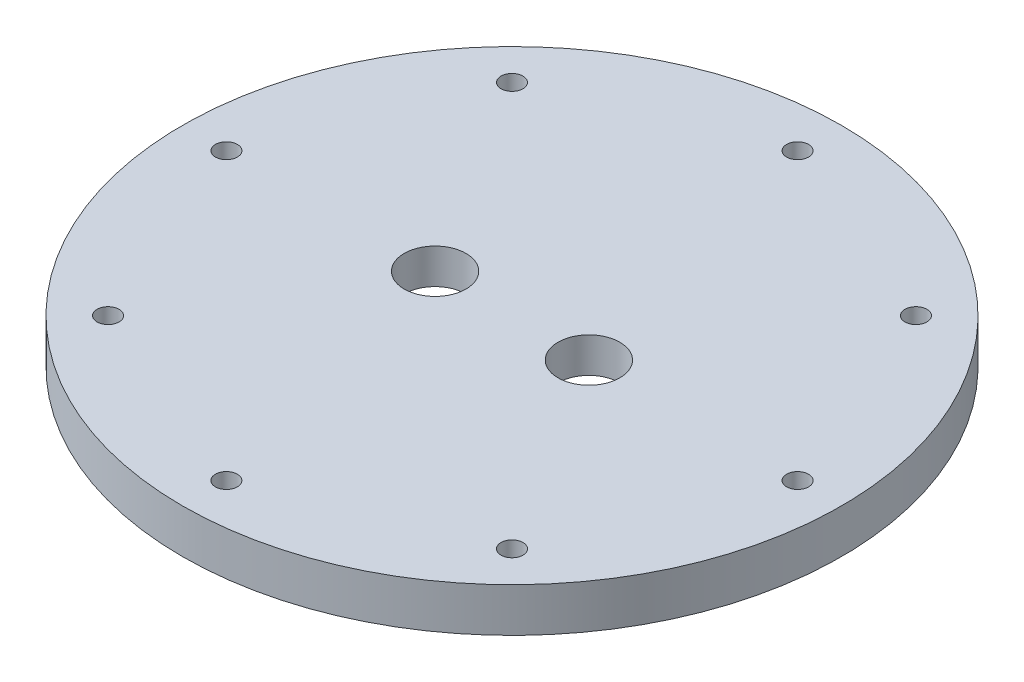
ISO-10303-21;
HEADER;
FILE_DESCRIPTION(('STEP AP214'),'2;1');
FILE_NAME('part.step','',(''),(''),'','','');
FILE_SCHEMA(('AUTOMOTIVE_DESIGN { 1 0 10303 214 1 1 1 1 }'));
ENDSEC;
DATA;
#1=APPLICATION_CONTEXT('core data for automotive mechanical design processes');
#2=APPLICATION_PROTOCOL_DEFINITION('international standard','automotive_design',2000,#1);
#3=PRODUCT_CONTEXT('',#1,'mechanical');
#4=PRODUCT('Part','Part','',(#3));
#5=PRODUCT_RELATED_PRODUCT_CATEGORY('part','',(#4));
#6=PRODUCT_DEFINITION_FORMATION('','',#4);
#7=PRODUCT_DEFINITION_CONTEXT('part definition',#1,'design');
#8=PRODUCT_DEFINITION('design','',#6,#7);
#9=PRODUCT_DEFINITION_SHAPE('','',#8);
#10=(LENGTH_UNIT() NAMED_UNIT(*) SI_UNIT(.MILLI.,.METRE.));
#11=(NAMED_UNIT(*) PLANE_ANGLE_UNIT() SI_UNIT($,.RADIAN.));
#12=(NAMED_UNIT(*) SI_UNIT($,.STERADIAN.) SOLID_ANGLE_UNIT());
#13=UNCERTAINTY_MEASURE_WITH_UNIT(LENGTH_MEASURE(1.E-05),#10,'distance_accuracy_value','');
#14=(GEOMETRIC_REPRESENTATION_CONTEXT(3) GLOBAL_UNCERTAINTY_ASSIGNED_CONTEXT((#13)) GLOBAL_UNIT_ASSIGNED_CONTEXT((#10,
#11,#12)) REPRESENTATION_CONTEXT('',''));
#15=CARTESIAN_POINT('',(0.,0.,0.));
#16=DIRECTION('',(0.,0.,1.));
#17=DIRECTION('',(1.,0.,0.));
#18=AXIS2_PLACEMENT_3D('',#15,#16,#17);
#19=CARTESIAN_POINT('',(0.,12.7,0.));
#20=DIRECTION('',(0.,-1.,0.));
#21=DIRECTION('',(0.,0.,-1.));
#22=AXIS2_PLACEMENT_3D('',#19,#20,#21);
#23=CYLINDRICAL_SURFACE('',#22,95.25);
#24=CARTESIAN_POINT('',(0.,12.7,0.));
#25=DIRECTION('',(0.,1.,0.));
#26=DIRECTION('',(0.,0.,1.));
#27=AXIS2_PLACEMENT_3D('',#24,#25,#26);
#28=CIRCLE('',#27,95.25);
#29=CARTESIAN_POINT('',(0.,12.7,95.25));
#30=VERTEX_POINT('',#29);
#31=EDGE_CURVE('E10',#30,#30,#28,.T.);
#32=ORIENTED_EDGE('',*,*,#31,.F.);
#33=EDGE_LOOP('',(#32));
#34=FACE_BOUND('',#33,.T.);
#35=CARTESIAN_POINT('',(0.,0.,0.));
#36=DIRECTION('',(0.,1.,0.));
#37=DIRECTION('',(0.,0.,1.));
#38=AXIS2_PLACEMENT_3D('',#35,#36,#37);
#39=CIRCLE('',#38,95.25);
#40=CARTESIAN_POINT('',(0.,0.,95.25));
#41=VERTEX_POINT('',#40);
#42=EDGE_CURVE('E40',#41,#41,#39,.T.);
#43=ORIENTED_EDGE('',*,*,#42,.T.);
#44=EDGE_LOOP('',(#43));
#45=FACE_BOUND('',#44,.T.);
#46=ADVANCED_FACE('F37',(#34,#45),#23,.T.);
#47=CARTESIAN_POINT('',(0.,12.7,0.));
#48=DIRECTION('',(0.,1.,0.));
#49=DIRECTION('',(0.,0.,1.));
#50=AXIS2_PLACEMENT_3D('',#47,#48,#49);
#51=PLANE('',#50);
#52=CARTESIAN_POINT('',(22.225,12.7,0.));
#53=DIRECTION('',(0.,1.,0.));
#54=DIRECTION('',(0.,0.,1.));
#55=AXIS2_PLACEMENT_3D('',#52,#53,#54);
#56=CIRCLE('',#55,8.929751);
#57=CARTESIAN_POINT('',(22.225,12.7,8.929751));
#58=VERTEX_POINT('',#57);
#59=EDGE_CURVE('E146',#58,#58,#56,.T.);
#60=ORIENTED_EDGE('',*,*,#59,.F.);
#61=EDGE_LOOP('',(#60));
#62=FACE_BOUND('',#61,.T.);
#63=CARTESIAN_POINT('',(-22.225,12.7,0.));
#64=DIRECTION('',(0.,1.,0.));
#65=DIRECTION('',(0.,0.,1.));
#66=AXIS2_PLACEMENT_3D('',#63,#64,#65);
#67=CIRCLE('',#66,8.929751);
#68=CARTESIAN_POINT('',(-22.225,12.7,8.92975099999999));
#69=VERTEX_POINT('',#68);
#70=EDGE_CURVE('E135',#69,#69,#67,.T.);
#71=ORIENTED_EDGE('',*,*,#70,.F.);
#72=EDGE_LOOP('',(#71));
#73=FACE_BOUND('',#72,.T.);
#74=CARTESIAN_POINT('',(58.3716647869488,12.7,58.3716647869502));
#75=DIRECTION('',(0.,-1.,0.));
#76=DIRECTION('',(0.,0.,-1.));
#77=AXIS2_PLACEMENT_3D('',#74,#75,#76);
#78=CIRCLE('',#77,3.175);
#79=CARTESIAN_POINT('',(58.3716647869488,12.7,55.1966647869502));
#80=VERTEX_POINT('',#79);
#81=EDGE_CURVE('E106',#80,#80,#78,.T.);
#82=ORIENTED_EDGE('',*,*,#81,.T.);
#83=EDGE_LOOP('',(#82));
#84=FACE_BOUND('',#83,.T.);
#85=CARTESIAN_POINT('',(82.55,12.7,8.64665353564502E-13));
#86=DIRECTION('',(0.,-1.,0.));
#87=DIRECTION('',(0.,0.,-1.));
#88=AXIS2_PLACEMENT_3D('',#85,#86,#87);
#89=CIRCLE('',#88,3.175);
#90=CARTESIAN_POINT('',(82.55,12.7,-3.17499999999913));
#91=VERTEX_POINT('',#90);
#92=EDGE_CURVE('E98',#91,#91,#89,.T.);
#93=ORIENTED_EDGE('',*,*,#92,.T.);
#94=EDGE_LOOP('',(#93));
#95=FACE_BOUND('',#94,.T.);
#96=CARTESIAN_POINT('',(58.37166478695,12.7,-58.371664786949));
#97=DIRECTION('',(0.,-1.,0.));
#98=DIRECTION('',(0.,0.,-1.));
#99=AXIS2_PLACEMENT_3D('',#96,#97,#98);
#100=CIRCLE('',#99,3.175);
#101=CARTESIAN_POINT('',(58.37166478695,12.7,-61.546664786949));
#102=VERTEX_POINT('',#101);
#103=EDGE_CURVE('E90',#102,#102,#100,.T.);
#104=ORIENTED_EDGE('',*,*,#103,.T.);
#105=EDGE_LOOP('',(#104));
#106=FACE_BOUND('',#105,.T.);
#107=CARTESIAN_POINT('',(0.,12.7,-82.55));
#108=DIRECTION('',(0.,-1.,0.));
#109=DIRECTION('',(0.,0.,-1.));
#110=AXIS2_PLACEMENT_3D('',#107,#108,#109);
#111=CIRCLE('',#110,3.175);
#112=CARTESIAN_POINT('',(0.,12.7,-85.725));
#113=VERTEX_POINT('',#112);
#114=EDGE_CURVE('E82',#113,#113,#111,.T.);
#115=ORIENTED_EDGE('',*,*,#114,.T.);
#116=EDGE_LOOP('',(#115));
#117=FACE_BOUND('',#116,.T.);
#118=CARTESIAN_POINT('',(-58.3716647869492,12.7,-58.3716647869498));
#119=DIRECTION('',(0.,-1.,0.));
#120=DIRECTION('',(0.,0.,-1.));
#121=AXIS2_PLACEMENT_3D('',#118,#119,#120);
#122=CIRCLE('',#121,3.175);
#123=CARTESIAN_POINT('',(-58.3716647869492,12.7,-61.5466647869498));
#124=VERTEX_POINT('',#123);
#125=EDGE_CURVE('E74',#124,#124,#122,.T.);
#126=ORIENTED_EDGE('',*,*,#125,.T.);
#127=EDGE_LOOP('',(#126));
#128=FACE_BOUND('',#127,.T.);
#129=CARTESIAN_POINT('',(-82.55,12.7,-2.88221784521501E-13));
#130=DIRECTION('',(0.,-1.,0.));
#131=DIRECTION('',(0.,0.,-1.));
#132=AXIS2_PLACEMENT_3D('',#129,#130,#131);
#133=CIRCLE('',#132,3.175);
#134=CARTESIAN_POINT('',(-82.55,12.7,-3.17500000000029));
#135=VERTEX_POINT('',#134);
#136=EDGE_CURVE('E66',#135,#135,#133,.T.);
#137=ORIENTED_EDGE('',*,*,#136,.T.);
#138=EDGE_LOOP('',(#137));
#139=FACE_BOUND('',#138,.T.);
#140=CARTESIAN_POINT('',(-58.3716647869496,12.7,58.3716647869494));
#141=DIRECTION('',(0.,-1.,0.));
#142=DIRECTION('',(0.,0.,-1.));
#143=AXIS2_PLACEMENT_3D('',#140,#141,#142);
#144=CIRCLE('',#143,3.175);
#145=CARTESIAN_POINT('',(-58.3716647869496,12.7,55.1966647869494));
#146=VERTEX_POINT('',#145);
#147=EDGE_CURVE('E58',#146,#146,#144,.T.);
#148=ORIENTED_EDGE('',*,*,#147,.T.);
#149=EDGE_LOOP('',(#148));
#150=FACE_BOUND('',#149,.T.);
#151=CARTESIAN_POINT('',(0.,12.7,82.55));
#152=DIRECTION('',(0.,-1.,0.));
#153=DIRECTION('',(0.,0.,-1.));
#154=AXIS2_PLACEMENT_3D('',#151,#152,#153);
#155=CIRCLE('',#154,3.175);
#156=CARTESIAN_POINT('',(0.,12.7,79.375));
#157=VERTEX_POINT('',#156);
#158=EDGE_CURVE('E49',#157,#157,#155,.T.);
#159=ORIENTED_EDGE('',*,*,#158,.T.);
#160=EDGE_LOOP('',(#159));
#161=FACE_BOUND('',#160,.T.);
#162=ORIENTED_EDGE('',*,*,#31,.T.);
#163=EDGE_LOOP('',(#162));
#164=FACE_BOUND('',#163,.T.);
#165=ADVANCED_FACE('F180',(#62,#73,#84,#95,#106,#117,#128,#139,#150,#161,#164),#51,.T.);
#166=CARTESIAN_POINT('',(0.,0.,0.));
#167=DIRECTION('',(0.,1.,0.));
#168=DIRECTION('',(0.,0.,1.));
#169=AXIS2_PLACEMENT_3D('',#166,#167,#168);
#170=PLANE('',#169);
#171=CARTESIAN_POINT('',(0.,0.,0.));
#172=DIRECTION('',(0.,-1.,0.));
#173=DIRECTION('',(0.,0.,-1.));
#174=AXIS2_PLACEMENT_3D('',#171,#172,#173);
#175=CIRCLE('',#174,69.9135);
#176=CARTESIAN_POINT('',(0.,0.,-69.9135));
#177=VERTEX_POINT('',#176);
#178=EDGE_CURVE('E115',#177,#177,#175,.T.);
#179=ORIENTED_EDGE('',*,*,#178,.F.);
#180=EDGE_LOOP('',(#179));
#181=FACE_BOUND('',#180,.T.);
#182=CARTESIAN_POINT('',(58.3716647869488,0.,58.3716647869502));
#183=DIRECTION('',(0.,-1.,0.));
#184=DIRECTION('',(0.,0.,-1.));
#185=AXIS2_PLACEMENT_3D('',#182,#183,#184);
#186=CIRCLE('',#185,3.17499999999998);
#187=CARTESIAN_POINT('',(58.3716647869488,0.,55.1966647869502));
#188=VERTEX_POINT('',#187);
#189=EDGE_CURVE('E110',#188,#188,#186,.T.);
#190=ORIENTED_EDGE('',*,*,#189,.F.);
#191=EDGE_LOOP('',(#190));
#192=FACE_BOUND('',#191,.T.);
#193=CARTESIAN_POINT('',(82.55,0.,8.64665353564502E-13));
#194=DIRECTION('',(0.,-1.,0.));
#195=DIRECTION('',(0.,0.,-1.));
#196=AXIS2_PLACEMENT_3D('',#193,#194,#195);
#197=CIRCLE('',#196,3.17499999999998);
#198=CARTESIAN_POINT('',(82.55,0.,-3.17499999999912));
#199=VERTEX_POINT('',#198);
#200=EDGE_CURVE('E102',#199,#199,#197,.T.);
#201=ORIENTED_EDGE('',*,*,#200,.F.);
#202=EDGE_LOOP('',(#201));
#203=FACE_BOUND('',#202,.T.);
#204=CARTESIAN_POINT('',(58.37166478695,0.,-58.371664786949));
#205=DIRECTION('',(0.,-1.,0.));
#206=DIRECTION('',(0.,0.,-1.));
#207=AXIS2_PLACEMENT_3D('',#204,#205,#206);
#208=CIRCLE('',#207,3.17499999999999);
#209=CARTESIAN_POINT('',(58.37166478695,0.,-61.546664786949));
#210=VERTEX_POINT('',#209);
#211=EDGE_CURVE('E94',#210,#210,#208,.T.);
#212=ORIENTED_EDGE('',*,*,#211,.F.);
#213=EDGE_LOOP('',(#212));
#214=FACE_BOUND('',#213,.T.);
#215=CARTESIAN_POINT('',(0.,0.,-82.55));
#216=DIRECTION('',(0.,-1.,0.));
#217=DIRECTION('',(0.,0.,-1.));
#218=AXIS2_PLACEMENT_3D('',#215,#216,#217);
#219=CIRCLE('',#218,3.17499999999999);
#220=CARTESIAN_POINT('',(0.,0.,-85.725));
#221=VERTEX_POINT('',#220);
#222=EDGE_CURVE('E86',#221,#221,#219,.T.);
#223=ORIENTED_EDGE('',*,*,#222,.F.);
#224=EDGE_LOOP('',(#223));
#225=FACE_BOUND('',#224,.T.);
#226=CARTESIAN_POINT('',(-58.3716647869492,0.,-58.3716647869498));
#227=DIRECTION('',(0.,-1.,0.));
#228=DIRECTION('',(0.,0.,-1.));
#229=AXIS2_PLACEMENT_3D('',#226,#227,#228);
#230=CIRCLE('',#229,3.17499999999998);
#231=CARTESIAN_POINT('',(-58.3716647869492,0.,-61.5466647869498));
#232=VERTEX_POINT('',#231);
#233=EDGE_CURVE('E78',#232,#232,#230,.T.);
#234=ORIENTED_EDGE('',*,*,#233,.F.);
#235=EDGE_LOOP('',(#234));
#236=FACE_BOUND('',#235,.T.);
#237=CARTESIAN_POINT('',(-82.55,0.,-2.88221784521501E-13));
#238=DIRECTION('',(0.,-1.,0.));
#239=DIRECTION('',(0.,0.,-1.));
#240=AXIS2_PLACEMENT_3D('',#237,#238,#239);
#241=CIRCLE('',#240,3.17499999999998);
#242=CARTESIAN_POINT('',(-82.55,0.,-3.17500000000027));
#243=VERTEX_POINT('',#242);
#244=EDGE_CURVE('E70',#243,#243,#241,.T.);
#245=ORIENTED_EDGE('',*,*,#244,.F.);
#246=EDGE_LOOP('',(#245));
#247=FACE_BOUND('',#246,.T.);
#248=CARTESIAN_POINT('',(-58.3716647869496,0.,58.3716647869494));
#249=DIRECTION('',(0.,-1.,0.));
#250=DIRECTION('',(0.,0.,-1.));
#251=AXIS2_PLACEMENT_3D('',#248,#249,#250);
#252=CIRCLE('',#251,3.17499999999999);
#253=CARTESIAN_POINT('',(-58.3716647869496,0.,55.1966647869494));
#254=VERTEX_POINT('',#253);
#255=EDGE_CURVE('E62',#254,#254,#252,.T.);
#256=ORIENTED_EDGE('',*,*,#255,.F.);
#257=EDGE_LOOP('',(#256));
#258=FACE_BOUND('',#257,.T.);
#259=CARTESIAN_POINT('',(0.,0.,82.55));
#260=DIRECTION('',(0.,-1.,0.));
#261=DIRECTION('',(0.,0.,-1.));
#262=AXIS2_PLACEMENT_3D('',#259,#260,#261);
#263=CIRCLE('',#262,3.17499999999999);
#264=CARTESIAN_POINT('',(0.,0.,79.375));
#265=VERTEX_POINT('',#264);
#266=EDGE_CURVE('E54',#265,#265,#263,.T.);
#267=ORIENTED_EDGE('',*,*,#266,.F.);
#268=EDGE_LOOP('',(#267));
#269=FACE_BOUND('',#268,.T.);
#270=ORIENTED_EDGE('',*,*,#42,.F.);
#271=EDGE_LOOP('',(#270));
#272=FACE_BOUND('',#271,.T.);
#273=ADVANCED_FACE('F185',(#181,#192,#203,#214,#225,#236,#247,#258,#269,#272),#170,.F.);
#274=CARTESIAN_POINT('',(0.,0.,82.55));
#275=DIRECTION('',(0.,-1.,0.));
#276=DIRECTION('',(0.,0.,-1.));
#277=AXIS2_PLACEMENT_3D('',#274,#275,#276);
#278=CYLINDRICAL_SURFACE('',#277,3.17499999999999);
#279=ORIENTED_EDGE('',*,*,#158,.F.);
#280=EDGE_LOOP('',(#279));
#281=FACE_BOUND('',#280,.T.);
#282=ORIENTED_EDGE('',*,*,#266,.T.);
#283=EDGE_LOOP('',(#282));
#284=FACE_BOUND('',#283,.T.);
#285=ADVANCED_FACE('F192',(#281,#284),#278,.F.);
#286=CARTESIAN_POINT('',(-58.3716647869496,0.,58.3716647869494));
#287=DIRECTION('',(0.,-1.,0.));
#288=DIRECTION('',(0.,0.,-1.));
#289=AXIS2_PLACEMENT_3D('',#286,#287,#288);
#290=CYLINDRICAL_SURFACE('',#289,3.17499999999999);
#291=ORIENTED_EDGE('',*,*,#147,.F.);
#292=EDGE_LOOP('',(#291));
#293=FACE_BOUND('',#292,.T.);
#294=ORIENTED_EDGE('',*,*,#255,.T.);
#295=EDGE_LOOP('',(#294));
#296=FACE_BOUND('',#295,.T.);
#297=ADVANCED_FACE('F197',(#293,#296),#290,.F.);
#298=CARTESIAN_POINT('',(-82.55,0.,-2.88221784521501E-13));
#299=DIRECTION('',(0.,-1.,0.));
#300=DIRECTION('',(0.,0.,-1.));
#301=AXIS2_PLACEMENT_3D('',#298,#299,#300);
#302=CYLINDRICAL_SURFACE('',#301,3.17499999999999);
#303=ORIENTED_EDGE('',*,*,#136,.F.);
#304=EDGE_LOOP('',(#303));
#305=FACE_BOUND('',#304,.T.);
#306=ORIENTED_EDGE('',*,*,#244,.T.);
#307=EDGE_LOOP('',(#306));
#308=FACE_BOUND('',#307,.T.);
#309=ADVANCED_FACE('F205',(#305,#308),#302,.F.);
#310=CARTESIAN_POINT('',(-58.3716647869492,0.,-58.3716647869498));
#311=DIRECTION('',(0.,-1.,0.));
#312=DIRECTION('',(0.,0.,-1.));
#313=AXIS2_PLACEMENT_3D('',#310,#311,#312);
#314=CYLINDRICAL_SURFACE('',#313,3.17499999999999);
#315=ORIENTED_EDGE('',*,*,#125,.F.);
#316=EDGE_LOOP('',(#315));
#317=FACE_BOUND('',#316,.T.);
#318=ORIENTED_EDGE('',*,*,#233,.T.);
#319=EDGE_LOOP('',(#318));
#320=FACE_BOUND('',#319,.T.);
#321=ADVANCED_FACE('F209',(#317,#320),#314,.F.);
#322=CARTESIAN_POINT('',(0.,0.,-82.55));
#323=DIRECTION('',(0.,-1.,0.));
#324=DIRECTION('',(0.,0.,-1.));
#325=AXIS2_PLACEMENT_3D('',#322,#323,#324);
#326=CYLINDRICAL_SURFACE('',#325,3.17499999999999);
#327=ORIENTED_EDGE('',*,*,#114,.F.);
#328=EDGE_LOOP('',(#327));
#329=FACE_BOUND('',#328,.T.);
#330=ORIENTED_EDGE('',*,*,#222,.T.);
#331=EDGE_LOOP('',(#330));
#332=FACE_BOUND('',#331,.T.);
#333=ADVANCED_FACE('F213',(#329,#332),#326,.F.);
#334=CARTESIAN_POINT('',(58.37166478695,0.,-58.371664786949));
#335=DIRECTION('',(0.,-1.,0.));
#336=DIRECTION('',(0.,0.,-1.));
#337=AXIS2_PLACEMENT_3D('',#334,#335,#336);
#338=CYLINDRICAL_SURFACE('',#337,3.17499999999999);
#339=ORIENTED_EDGE('',*,*,#103,.F.);
#340=EDGE_LOOP('',(#339));
#341=FACE_BOUND('',#340,.T.);
#342=ORIENTED_EDGE('',*,*,#211,.T.);
#343=EDGE_LOOP('',(#342));
#344=FACE_BOUND('',#343,.T.);
#345=ADVANCED_FACE('F217',(#341,#344),#338,.F.);
#346=CARTESIAN_POINT('',(82.55,0.,8.64665353564502E-13));
#347=DIRECTION('',(0.,-1.,0.));
#348=DIRECTION('',(0.,0.,-1.));
#349=AXIS2_PLACEMENT_3D('',#346,#347,#348);
#350=CYLINDRICAL_SURFACE('',#349,3.17499999999999);
#351=ORIENTED_EDGE('',*,*,#92,.F.);
#352=EDGE_LOOP('',(#351));
#353=FACE_BOUND('',#352,.T.);
#354=ORIENTED_EDGE('',*,*,#200,.T.);
#355=EDGE_LOOP('',(#354));
#356=FACE_BOUND('',#355,.T.);
#357=ADVANCED_FACE('F221',(#353,#356),#350,.F.);
#358=CARTESIAN_POINT('',(58.3716647869488,0.,58.3716647869502));
#359=DIRECTION('',(0.,-1.,0.));
#360=DIRECTION('',(0.,0.,-1.));
#361=AXIS2_PLACEMENT_3D('',#358,#359,#360);
#362=CYLINDRICAL_SURFACE('',#361,3.17499999999999);
#363=ORIENTED_EDGE('',*,*,#81,.F.);
#364=EDGE_LOOP('',(#363));
#365=FACE_BOUND('',#364,.T.);
#366=ORIENTED_EDGE('',*,*,#189,.T.);
#367=EDGE_LOOP('',(#366));
#368=FACE_BOUND('',#367,.T.);
#369=ADVANCED_FACE('F225',(#365,#368),#362,.F.);
#370=CARTESIAN_POINT('',(0.,2.54,0.));
#371=DIRECTION('',(0.,-1.,0.));
#372=DIRECTION('',(0.,0.,-1.));
#373=AXIS2_PLACEMENT_3D('',#370,#371,#372);
#374=CYLINDRICAL_SURFACE('',#373,69.9135);
#375=CARTESIAN_POINT('',(0.,2.54,0.));
#376=DIRECTION('',(0.,-1.,0.));
#377=DIRECTION('',(0.,0.,-1.));
#378=AXIS2_PLACEMENT_3D('',#375,#376,#377);
#379=CIRCLE('',#378,69.9135);
#380=CARTESIAN_POINT('',(0.,2.54,-69.9135));
#381=VERTEX_POINT('',#380);
#382=EDGE_CURVE('E114',#381,#381,#379,.T.);
#383=ORIENTED_EDGE('',*,*,#382,.F.);
#384=EDGE_LOOP('',(#383));
#385=FACE_BOUND('',#384,.T.);
#386=ORIENTED_EDGE('',*,*,#178,.T.);
#387=EDGE_LOOP('',(#386));
#388=FACE_BOUND('',#387,.T.);
#389=ADVANCED_FACE('F229',(#385,#388),#374,.F.);
#390=CARTESIAN_POINT('',(0.,2.54,0.));
#391=DIRECTION('',(0.,-1.,0.));
#392=DIRECTION('',(0.,0.,-1.));
#393=AXIS2_PLACEMENT_3D('',#390,#391,#392);
#394=PLANE('',#393);
#395=CARTESIAN_POINT('',(0.,2.54,0.));
#396=DIRECTION('',(0.,-1.,0.));
#397=DIRECTION('',(0.,0.,-1.));
#398=AXIS2_PLACEMENT_3D('',#395,#396,#397);
#399=CIRCLE('',#398,68.3133);
#400=CARTESIAN_POINT('',(0.,2.54,-68.3133));
#401=VERTEX_POINT('',#400);
#402=EDGE_CURVE('E123',#401,#401,#399,.T.);
#403=ORIENTED_EDGE('',*,*,#402,.F.);
#404=EDGE_LOOP('',(#403));
#405=FACE_BOUND('',#404,.T.);
#406=ORIENTED_EDGE('',*,*,#382,.T.);
#407=EDGE_LOOP('',(#406));
#408=FACE_BOUND('',#407,.T.);
#409=ADVANCED_FACE('F163',(#405,#408),#394,.T.);
#410=CARTESIAN_POINT('',(0.,3.8608,0.));
#411=DIRECTION('',(0.,-1.,0.));
#412=DIRECTION('',(0.,0.,-1.));
#413=AXIS2_PLACEMENT_3D('',#410,#411,#412);
#414=CYLINDRICAL_SURFACE('',#413,68.3133);
#415=CARTESIAN_POINT('',(0.,3.8608,0.));
#416=DIRECTION('',(0.,-1.,0.));
#417=DIRECTION('',(0.,0.,-1.));
#418=AXIS2_PLACEMENT_3D('',#415,#416,#417);
#419=CIRCLE('',#418,68.3133);
#420=CARTESIAN_POINT('',(0.,3.8608,-68.3133));
#421=VERTEX_POINT('',#420);
#422=EDGE_CURVE('E119',#421,#421,#419,.T.);
#423=ORIENTED_EDGE('',*,*,#422,.F.);
#424=EDGE_LOOP('',(#423));
#425=FACE_BOUND('',#424,.T.);
#426=ORIENTED_EDGE('',*,*,#402,.T.);
#427=EDGE_LOOP('',(#426));
#428=FACE_BOUND('',#427,.T.);
#429=ADVANCED_FACE('F175',(#425,#428),#414,.F.);
#430=CARTESIAN_POINT('',(0.,3.8608,0.));
#431=DIRECTION('',(0.,-1.,0.));
#432=DIRECTION('',(0.,0.,-1.));
#433=AXIS2_PLACEMENT_3D('',#430,#431,#432);
#434=PLANE('',#433);
#435=CARTESIAN_POINT('',(0.,3.8608,0.));
#436=DIRECTION('',(0.,-1.,0.));
#437=DIRECTION('',(0.,0.,-1.));
#438=AXIS2_PLACEMENT_3D('',#435,#436,#437);
#439=CIRCLE('',#438,66.1289);
#440=CARTESIAN_POINT('',(0.,3.8608,-66.1289));
#441=VERTEX_POINT('',#440);
#442=EDGE_CURVE('E127',#441,#441,#439,.T.);
#443=ORIENTED_EDGE('',*,*,#442,.F.);
#444=EDGE_LOOP('',(#443));
#445=FACE_BOUND('',#444,.T.);
#446=ORIENTED_EDGE('',*,*,#422,.T.);
#447=EDGE_LOOP('',(#446));
#448=FACE_BOUND('',#447,.T.);
#449=ADVANCED_FACE('F169',(#445,#448),#434,.T.);
#450=CARTESIAN_POINT('',(0.,3.8608,0.));
#451=DIRECTION('',(0.,-1.,0.));
#452=DIRECTION('',(0.,0.,-1.));
#453=AXIS2_PLACEMENT_3D('',#450,#451,#452);
#454=CYLINDRICAL_SURFACE('',#453,66.1289);
#455=ORIENTED_EDGE('',*,*,#442,.T.);
#456=EDGE_LOOP('',(#455));
#457=FACE_BOUND('',#456,.T.);
#458=CARTESIAN_POINT('',(0.,2.54,0.));
#459=DIRECTION('',(0.,-1.,0.));
#460=DIRECTION('',(0.,0.,-1.));
#461=AXIS2_PLACEMENT_3D('',#458,#459,#460);
#462=CIRCLE('',#461,66.1289);
#463=CARTESIAN_POINT('',(0.,2.54,-66.1289));
#464=VERTEX_POINT('',#463);
#465=EDGE_CURVE('E131',#464,#464,#462,.T.);
#466=ORIENTED_EDGE('',*,*,#465,.F.);
#467=EDGE_LOOP('',(#466));
#468=FACE_BOUND('',#467,.T.);
#469=ADVANCED_FACE('F161',(#457,#468),#454,.T.);
#470=CARTESIAN_POINT('',(22.225,2.54,0.));
#471=DIRECTION('',(0.,-1.,0.));
#472=DIRECTION('',(0.,0.,-1.));
#473=AXIS2_PLACEMENT_3D('',#470,#471,#472);
#474=CIRCLE('',#473,8.929751);
#475=CARTESIAN_POINT('',(22.225,2.54,-8.929751));
#476=VERTEX_POINT('',#475);
#477=EDGE_CURVE('E150',#476,#476,#474,.T.);
#478=ORIENTED_EDGE('',*,*,#477,.F.);
#479=EDGE_LOOP('',(#478));
#480=FACE_BOUND('',#479,.T.);
#481=CARTESIAN_POINT('',(-22.225,2.54,0.));
#482=DIRECTION('',(0.,-1.,0.));
#483=DIRECTION('',(0.,0.,-1.));
#484=AXIS2_PLACEMENT_3D('',#481,#482,#483);
#485=CIRCLE('',#484,8.929751);
#486=CARTESIAN_POINT('',(-22.225,2.54,-8.92975100000001));
#487=VERTEX_POINT('',#486);
#488=EDGE_CURVE('E142',#487,#487,#485,.T.);
#489=ORIENTED_EDGE('',*,*,#488,.F.);
#490=EDGE_LOOP('',(#489));
#491=FACE_BOUND('',#490,.T.);
#492=ORIENTED_EDGE('',*,*,#465,.T.);
#493=EDGE_LOOP('',(#492));
#494=FACE_BOUND('',#493,.T.);
#495=ADVANCED_FACE('F157',(#480,#491,#494),#394,.T.);
#496=CARTESIAN_POINT('',(-22.225,2.54,0.));
#497=DIRECTION('',(0.,-1.,0.));
#498=DIRECTION('',(0.,0.,-1.));
#499=AXIS2_PLACEMENT_3D('',#496,#497,#498);
#500=CYLINDRICAL_SURFACE('',#499,8.929751);
#501=ORIENTED_EDGE('',*,*,#70,.T.);
#502=EDGE_LOOP('',(#501));
#503=FACE_BOUND('',#502,.T.);
#504=ORIENTED_EDGE('',*,*,#488,.T.);
#505=EDGE_LOOP('',(#504));
#506=FACE_BOUND('',#505,.T.);
#507=ADVANCED_FACE('F160',(#503,#506),#500,.F.);
#508=CARTESIAN_POINT('',(22.225,2.54,0.));
#509=DIRECTION('',(0.,-1.,0.));
#510=DIRECTION('',(0.,0.,-1.));
#511=AXIS2_PLACEMENT_3D('',#508,#509,#510);
#512=CYLINDRICAL_SURFACE('',#511,8.929751);
#513=ORIENTED_EDGE('',*,*,#59,.T.);
#514=EDGE_LOOP('',(#513));
#515=FACE_BOUND('',#514,.T.);
#516=ORIENTED_EDGE('',*,*,#477,.T.);
#517=EDGE_LOOP('',(#516));
#518=FACE_BOUND('',#517,.T.);
#519=ADVANCED_FACE('F155',(#515,#518),#512,.F.);
#520=CLOSED_SHELL('',(#46,#165,#273,#285,#297,#309,#321,#333,#345,#357,#369,#389,#409,#429,#449,
#469,#495,#507,#519));
#521=MANIFOLD_SOLID_BREP('B2',#520);
#522=ADVANCED_BREP_SHAPE_REPRESENTATION('',(#18,#521),#14);
#523=SHAPE_DEFINITION_REPRESENTATION(#9,#522);
ENDSEC;
END-ISO-10303-21;
